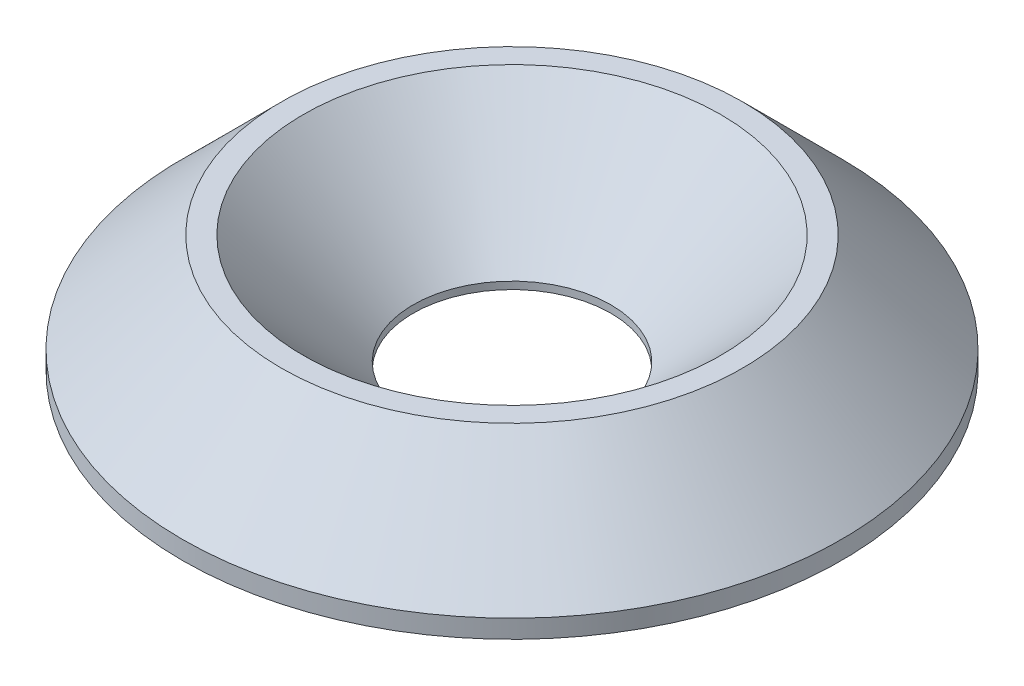
ISO-10303-21;
HEADER;
FILE_DESCRIPTION(('STEP AP214'),'2;1');
FILE_NAME('part.step','',(''),(''),'','','');
FILE_SCHEMA(('AUTOMOTIVE_DESIGN { 1 0 10303 214 1 1 1 1 }'));
ENDSEC;
DATA;
#1=APPLICATION_CONTEXT('core data for automotive mechanical design processes');
#2=APPLICATION_PROTOCOL_DEFINITION('international standard','automotive_design',2000,#1);
#3=PRODUCT_CONTEXT('',#1,'mechanical');
#4=PRODUCT('Part','Part','',(#3));
#5=PRODUCT_RELATED_PRODUCT_CATEGORY('part','',(#4));
#6=PRODUCT_DEFINITION_FORMATION('','',#4);
#7=PRODUCT_DEFINITION_CONTEXT('part definition',#1,'design');
#8=PRODUCT_DEFINITION('design','',#6,#7);
#9=PRODUCT_DEFINITION_SHAPE('','',#8);
#10=(LENGTH_UNIT() NAMED_UNIT(*) SI_UNIT(.MILLI.,.METRE.));
#11=(NAMED_UNIT(*) PLANE_ANGLE_UNIT() SI_UNIT($,.RADIAN.));
#12=(NAMED_UNIT(*) SI_UNIT($,.STERADIAN.) SOLID_ANGLE_UNIT());
#13=UNCERTAINTY_MEASURE_WITH_UNIT(LENGTH_MEASURE(1.E-05),#10,'distance_accuracy_value','');
#14=(GEOMETRIC_REPRESENTATION_CONTEXT(3) GLOBAL_UNCERTAINTY_ASSIGNED_CONTEXT((#13)) GLOBAL_UNIT_ASSIGNED_CONTEXT((#10,
#11,#12)) REPRESENTATION_CONTEXT('',''));
#15=CARTESIAN_POINT('',(0.,0.,0.));
#16=DIRECTION('',(0.,0.,1.));
#17=DIRECTION('',(1.,0.,0.));
#18=AXIS2_PLACEMENT_3D('',#15,#16,#17);
#19=CARTESIAN_POINT('',(0.,0.,0.));
#20=DIRECTION('',(0.,-1.,0.));
#21=DIRECTION('',(0.,0.,-1.));
#22=AXIS2_PLACEMENT_3D('',#19,#20,#21);
#23=CYLINDRICAL_SURFACE('',#22,4.5);
#24=CARTESIAN_POINT('',(0.,0.250000000000008,0.));
#25=DIRECTION('',(0.,-1.,0.));
#26=DIRECTION('',(0.,0.,-1.));
#27=AXIS2_PLACEMENT_3D('',#24,#25,#26);
#28=CIRCLE('',#27,4.5);
#29=CARTESIAN_POINT('',(0.,0.250000000000008,-4.5));
#30=VERTEX_POINT('',#29);
#31=EDGE_CURVE('E10',#30,#30,#28,.T.);
#32=ORIENTED_EDGE('',*,*,#31,.T.);
#33=EDGE_LOOP('',(#32));
#34=FACE_BOUND('',#33,.T.);
#35=CARTESIAN_POINT('',(0.,0.,0.));
#36=DIRECTION('',(0.,-1.,0.));
#37=DIRECTION('',(0.,0.,-1.));
#38=AXIS2_PLACEMENT_3D('',#35,#36,#37);
#39=CIRCLE('',#38,4.5);
#40=CARTESIAN_POINT('',(0.,0.,-4.5));
#41=VERTEX_POINT('',#40);
#42=EDGE_CURVE('E52',#41,#41,#39,.T.);
#43=ORIENTED_EDGE('',*,*,#42,.F.);
#44=EDGE_LOOP('',(#43));
#45=FACE_BOUND('',#44,.T.);
#46=ADVANCED_FACE('F30',(#34,#45),#23,.T.);
#47=CARTESIAN_POINT('',(0.,0.250000000000008,0.));
#48=DIRECTION('',(0.,-1.,0.));
#49=DIRECTION('',(0.,0.,-1.));
#50=AXIS2_PLACEMENT_3D('',#47,#48,#49);
#51=CONICAL_SURFACE('',#50,4.5,0.785398163397451);
#52=CARTESIAN_POINT('',(0.,1.6,0.));
#53=DIRECTION('',(0.,-1.,0.));
#54=DIRECTION('',(0.,0.,-1.));
#55=AXIS2_PLACEMENT_3D('',#52,#53,#54);
#56=CIRCLE('',#55,3.15);
#57=CARTESIAN_POINT('',(0.,1.6,-3.15));
#58=VERTEX_POINT('',#57);
#59=EDGE_CURVE('E36',#58,#58,#56,.T.);
#60=ORIENTED_EDGE('',*,*,#59,.T.);
#61=EDGE_LOOP('',(#60));
#62=FACE_BOUND('',#61,.T.);
#63=ORIENTED_EDGE('',*,*,#31,.F.);
#64=EDGE_LOOP('',(#63));
#65=FACE_BOUND('',#64,.T.);
#66=ADVANCED_FACE('F60',(#62,#65),#51,.T.);
#67=CARTESIAN_POINT('',(3.15,1.6,0.));
#68=DIRECTION('',(0.,1.,0.));
#69=DIRECTION('',(0.,0.,1.));
#70=AXIS2_PLACEMENT_3D('',#67,#68,#69);
#71=PLANE('',#70);
#72=CARTESIAN_POINT('',(0.,1.6,0.));
#73=DIRECTION('',(0.,-1.,0.));
#74=DIRECTION('',(0.,0.,-1.));
#75=AXIS2_PLACEMENT_3D('',#72,#73,#74);
#76=CIRCLE('',#75,2.85);
#77=CARTESIAN_POINT('',(0.,1.6,-2.85));
#78=VERTEX_POINT('',#77);
#79=EDGE_CURVE('E40',#78,#78,#76,.T.);
#80=ORIENTED_EDGE('',*,*,#79,.T.);
#81=EDGE_LOOP('',(#80));
#82=FACE_BOUND('',#81,.T.);
#83=ORIENTED_EDGE('',*,*,#59,.F.);
#84=EDGE_LOOP('',(#83));
#85=FACE_BOUND('',#84,.T.);
#86=ADVANCED_FACE('F64',(#82,#85),#71,.T.);
#87=CARTESIAN_POINT('',(0.,1.6,0.));
#88=DIRECTION('',(0.,1.,0.));
#89=DIRECTION('',(0.,0.,1.));
#90=AXIS2_PLACEMENT_3D('',#87,#88,#89);
#91=CONICAL_SURFACE('',#90,2.85,0.78539816339745);
#92=CARTESIAN_POINT('',(0.,0.100000000000004,0.));
#93=DIRECTION('',(0.,-1.,0.));
#94=DIRECTION('',(0.,0.,-1.));
#95=AXIS2_PLACEMENT_3D('',#92,#93,#94);
#96=CIRCLE('',#95,1.35);
#97=CARTESIAN_POINT('',(0.,0.100000000000004,-1.35));
#98=VERTEX_POINT('',#97);
#99=EDGE_CURVE('E44',#98,#98,#96,.T.);
#100=ORIENTED_EDGE('',*,*,#99,.T.);
#101=EDGE_LOOP('',(#100));
#102=FACE_BOUND('',#101,.T.);
#103=ORIENTED_EDGE('',*,*,#79,.F.);
#104=EDGE_LOOP('',(#103));
#105=FACE_BOUND('',#104,.T.);
#106=ADVANCED_FACE('F68',(#102,#105),#91,.F.);
#107=CARTESIAN_POINT('',(0.,0.,0.));
#108=DIRECTION('',(0.,-1.,0.));
#109=DIRECTION('',(0.,0.,-1.));
#110=AXIS2_PLACEMENT_3D('',#107,#108,#109);
#111=CYLINDRICAL_SURFACE('',#110,1.35);
#112=CARTESIAN_POINT('',(0.,0.,0.));
#113=DIRECTION('',(0.,-1.,0.));
#114=DIRECTION('',(0.,0.,-1.));
#115=AXIS2_PLACEMENT_3D('',#112,#113,#114);
#116=CIRCLE('',#115,1.35);
#117=CARTESIAN_POINT('',(0.,0.,-1.35));
#118=VERTEX_POINT('',#117);
#119=EDGE_CURVE('E49',#118,#118,#116,.T.);
#120=ORIENTED_EDGE('',*,*,#119,.T.);
#121=EDGE_LOOP('',(#120));
#122=FACE_BOUND('',#121,.T.);
#123=ORIENTED_EDGE('',*,*,#99,.F.);
#124=EDGE_LOOP('',(#123));
#125=FACE_BOUND('',#124,.T.);
#126=ADVANCED_FACE('F75',(#122,#125),#111,.F.);
#127=CARTESIAN_POINT('',(1.35,0.,0.));
#128=DIRECTION('',(0.,-1.,0.));
#129=DIRECTION('',(0.,0.,-1.));
#130=AXIS2_PLACEMENT_3D('',#127,#128,#129);
#131=PLANE('',#130);
#132=ORIENTED_EDGE('',*,*,#42,.T.);
#133=EDGE_LOOP('',(#132));
#134=FACE_BOUND('',#133,.T.);
#135=ORIENTED_EDGE('',*,*,#119,.F.);
#136=EDGE_LOOP('',(#135));
#137=FACE_BOUND('',#136,.T.);
#138=ADVANCED_FACE('F56',(#134,#137),#131,.T.);
#139=CLOSED_SHELL('',(#46,#66,#86,#106,#126,#138));
#140=MANIFOLD_SOLID_BREP('B2',#139);
#141=ADVANCED_BREP_SHAPE_REPRESENTATION('',(#18,#140),#14);
#142=SHAPE_DEFINITION_REPRESENTATION(#9,#141);
ENDSEC;
END-ISO-10303-21;
